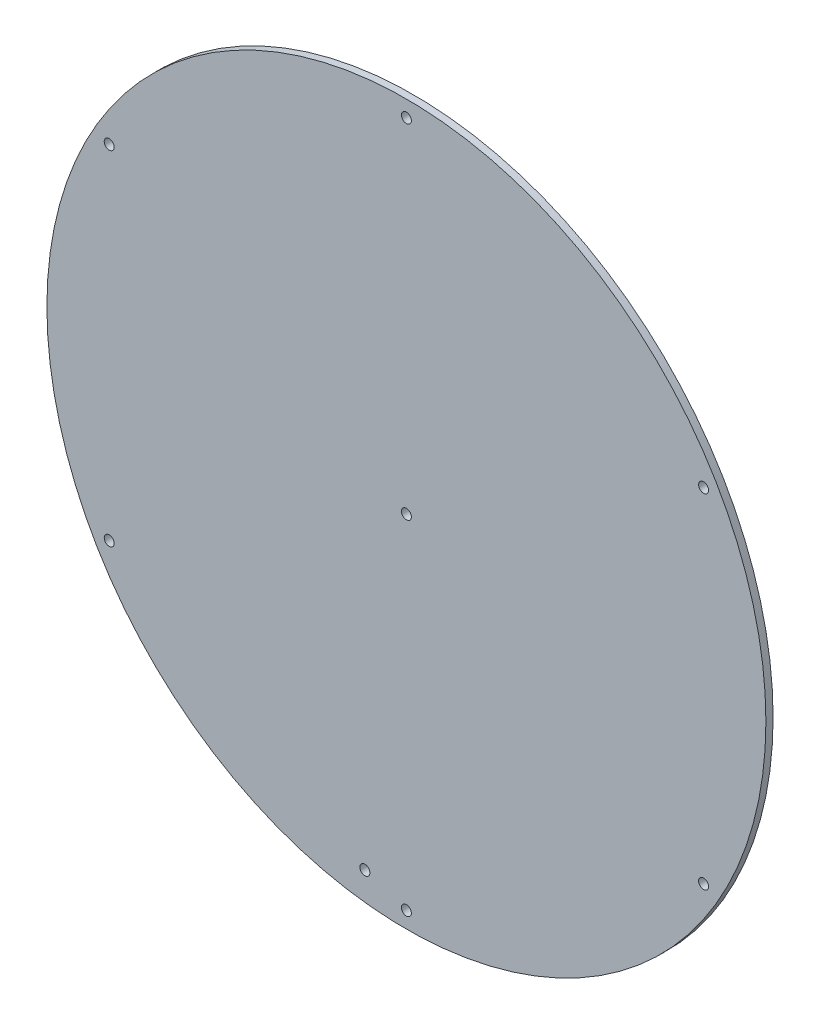
ISO-10303-21;
HEADER;
FILE_DESCRIPTION(('STEP AP214'),'2;1');
FILE_NAME('part.step','',(''),(''),'','','');
FILE_SCHEMA(('AUTOMOTIVE_DESIGN { 1 0 10303 214 1 1 1 1 }'));
ENDSEC;
DATA;
#1=APPLICATION_CONTEXT('core data for automotive mechanical design processes');
#2=APPLICATION_PROTOCOL_DEFINITION('international standard','automotive_design',2000,#1);
#3=PRODUCT_CONTEXT('',#1,'mechanical');
#4=PRODUCT('Part','Part','',(#3));
#5=PRODUCT_RELATED_PRODUCT_CATEGORY('part','',(#4));
#6=PRODUCT_DEFINITION_FORMATION('','',#4);
#7=PRODUCT_DEFINITION_CONTEXT('part definition',#1,'design');
#8=PRODUCT_DEFINITION('design','',#6,#7);
#9=PRODUCT_DEFINITION_SHAPE('','',#8);
#10=(LENGTH_UNIT() NAMED_UNIT(*) SI_UNIT(.MILLI.,.METRE.));
#11=(NAMED_UNIT(*) PLANE_ANGLE_UNIT() SI_UNIT($,.RADIAN.));
#12=(NAMED_UNIT(*) SI_UNIT($,.STERADIAN.) SOLID_ANGLE_UNIT());
#13=UNCERTAINTY_MEASURE_WITH_UNIT(LENGTH_MEASURE(1.E-05),#10,'distance_accuracy_value','');
#14=(GEOMETRIC_REPRESENTATION_CONTEXT(3) GLOBAL_UNCERTAINTY_ASSIGNED_CONTEXT((#13)) GLOBAL_UNIT_ASSIGNED_CONTEXT((#10,
#11,#12)) REPRESENTATION_CONTEXT('',''));
#15=CARTESIAN_POINT('',(0.,0.,0.));
#16=DIRECTION('',(0.,0.,1.));
#17=DIRECTION('',(1.,0.,0.));
#18=AXIS2_PLACEMENT_3D('',#15,#16,#17);
#19=CARTESIAN_POINT('',(0.,0.,2.2));
#20=DIRECTION('',(0.,0.,-1.));
#21=DIRECTION('',(-1.,0.,0.));
#22=AXIS2_PLACEMENT_3D('',#19,#20,#21);
#23=CYLINDRICAL_SURFACE('',#22,110.);
#24=CARTESIAN_POINT('',(0.,0.,2.2));
#25=DIRECTION('',(0.,0.,1.));
#26=DIRECTION('',(1.,0.,0.));
#27=AXIS2_PLACEMENT_3D('',#24,#25,#26);
#28=CIRCLE('',#27,110.);
#29=CARTESIAN_POINT('',(110.,0.,2.2));
#30=VERTEX_POINT('',#29);
#31=EDGE_CURVE('E11',#30,#30,#28,.T.);
#32=ORIENTED_EDGE('',*,*,#31,.F.);
#33=EDGE_LOOP('',(#32));
#34=FACE_BOUND('',#33,.T.);
#35=CARTESIAN_POINT('',(0.,0.,0.));
#36=DIRECTION('',(0.,0.,1.));
#37=DIRECTION('',(1.,0.,0.));
#38=AXIS2_PLACEMENT_3D('',#35,#36,#37);
#39=CIRCLE('',#38,110.);
#40=CARTESIAN_POINT('',(110.,0.,0.));
#41=VERTEX_POINT('',#40);
#42=EDGE_CURVE('E37',#41,#41,#39,.T.);
#43=ORIENTED_EDGE('',*,*,#42,.T.);
#44=EDGE_LOOP('',(#43));
#45=FACE_BOUND('',#44,.T.);
#46=ADVANCED_FACE('F34',(#34,#45),#23,.T.);
#47=CARTESIAN_POINT('',(0.,0.,2.2));
#48=DIRECTION('',(0.,0.,1.));
#49=DIRECTION('',(1.,0.,0.));
#50=AXIS2_PLACEMENT_3D('',#47,#48,#49);
#51=PLANE('',#50);
#52=CARTESIAN_POINT('',(-12.7,-100.6602,2.2));
#53=DIRECTION('',(0.,0.,-1.));
#54=DIRECTION('',(-1.,0.,0.));
#55=AXIS2_PLACEMENT_3D('',#52,#53,#54);
#56=CIRCLE('',#55,1.524);
#57=CARTESIAN_POINT('',(-14.224,-100.6602,2.2));
#58=VERTEX_POINT('',#57);
#59=EDGE_CURVE('E196',#58,#58,#56,.T.);
#60=ORIENTED_EDGE('',*,*,#59,.T.);
#61=EDGE_LOOP('',(#60));
#62=FACE_BOUND('',#61,.T.);
#63=CARTESIAN_POINT('',(0.,0.,2.2));
#64=DIRECTION('',(0.,0.,-1.));
#65=DIRECTION('',(-1.,0.,0.));
#66=AXIS2_PLACEMENT_3D('',#63,#64,#65);
#67=CIRCLE('',#66,1.52399999999999);
#68=CARTESIAN_POINT('',(-1.52399999999999,0.,2.2));
#69=VERTEX_POINT('',#68);
#70=EDGE_CURVE('E202',#69,#69,#67,.T.);
#71=ORIENTED_EDGE('',*,*,#70,.T.);
#72=EDGE_LOOP('',(#71));
#73=FACE_BOUND('',#72,.T.);
#74=CARTESIAN_POINT('',(90.9326673973654,52.5000000000011,2.2));
#75=DIRECTION('',(0.,0.,1.));
#76=DIRECTION('',(0.50000000000001,-0.866025403784433,0.));
#77=AXIS2_PLACEMENT_3D('',#74,#75,#76);
#78=CIRCLE('',#77,1.52399999999999);
#79=CARTESIAN_POINT('',(91.6946673973654,51.1801772846336,2.2));
#80=VERTEX_POINT('',#79);
#81=EDGE_CURVE('E320',#80,#80,#78,.T.);
#82=ORIENTED_EDGE('',*,*,#81,.F.);
#83=EDGE_LOOP('',(#82));
#84=FACE_BOUND('',#83,.T.);
#85=CARTESIAN_POINT('',(90.9326673973665,-52.4999999999992,2.2));
#86=DIRECTION('',(0.,0.,1.));
#87=DIRECTION('',(-0.499999999999992,-0.866025403784443,0.));
#88=AXIS2_PLACEMENT_3D('',#85,#86,#87);
#89=CIRCLE('',#88,1.52399999999999);
#90=CARTESIAN_POINT('',(90.1706673973666,-53.8198227153666,2.2));
#91=VERTEX_POINT('',#90);
#92=EDGE_CURVE('E330',#91,#91,#89,.T.);
#93=ORIENTED_EDGE('',*,*,#92,.F.);
#94=EDGE_LOOP('',(#93));
#95=FACE_BOUND('',#94,.T.);
#96=CARTESIAN_POINT('',(0.,-105.,2.2));
#97=DIRECTION('',(0.,0.,1.));
#98=DIRECTION('',(-1.,0.,0.));
#99=AXIS2_PLACEMENT_3D('',#96,#97,#98);
#100=CIRCLE('',#99,1.52399999999999);
#101=CARTESIAN_POINT('',(-1.52399999999999,-105.,2.2));
#102=VERTEX_POINT('',#101);
#103=EDGE_CURVE('E336',#102,#102,#100,.T.);
#104=ORIENTED_EDGE('',*,*,#103,.F.);
#105=EDGE_LOOP('',(#104));
#106=FACE_BOUND('',#105,.T.);
#107=CARTESIAN_POINT('',(-90.9326673973658,-52.5000000000004,2.2));
#108=DIRECTION('',(0.,0.,1.));
#109=DIRECTION('',(-0.500000000000004,0.866025403784436,0.));
#110=AXIS2_PLACEMENT_3D('',#107,#108,#109);
#111=CIRCLE('',#110,1.52399999999999);
#112=CARTESIAN_POINT('',(-91.6946673973658,-51.180177284633,2.2));
#113=VERTEX_POINT('',#112);
#114=EDGE_CURVE('E342',#113,#113,#111,.T.);
#115=ORIENTED_EDGE('',*,*,#114,.F.);
#116=EDGE_LOOP('',(#115));
#117=FACE_BOUND('',#116,.T.);
#118=CARTESIAN_POINT('',(-90.9326673973662,52.4999999999998,2.2));
#119=DIRECTION('',(0.,0.,1.));
#120=DIRECTION('',(0.499999999999998,0.86602540378444,0.));
#121=AXIS2_PLACEMENT_3D('',#118,#119,#120);
#122=CIRCLE('',#121,1.52399999999999);
#123=CARTESIAN_POINT('',(-90.1706673973662,53.8198227153673,2.2));
#124=VERTEX_POINT('',#123);
#125=EDGE_CURVE('E348',#124,#124,#122,.T.);
#126=ORIENTED_EDGE('',*,*,#125,.F.);
#127=EDGE_LOOP('',(#126));
#128=FACE_BOUND('',#127,.T.);
#129=CARTESIAN_POINT('',(0.,105.,2.2));
#130=DIRECTION('',(0.,0.,1.));
#131=DIRECTION('',(1.,0.,0.));
#132=AXIS2_PLACEMENT_3D('',#129,#130,#131);
#133=CIRCLE('',#132,1.52399999999999);
#134=CARTESIAN_POINT('',(1.52399999999999,105.,2.2));
#135=VERTEX_POINT('',#134);
#136=EDGE_CURVE('E354',#135,#135,#133,.T.);
#137=ORIENTED_EDGE('',*,*,#136,.F.);
#138=EDGE_LOOP('',(#137));
#139=FACE_BOUND('',#138,.T.);
#140=ORIENTED_EDGE('',*,*,#31,.T.);
#141=EDGE_LOOP('',(#140));
#142=FACE_BOUND('',#141,.T.);
#143=ADVANCED_FACE('F365',(#62,#73,#84,#95,#106,#117,#128,#139,#142),#51,.T.);
#144=CARTESIAN_POINT('',(0.,0.,0.));
#145=DIRECTION('',(0.,0.,1.));
#146=DIRECTION('',(1.,0.,0.));
#147=AXIS2_PLACEMENT_3D('',#144,#145,#146);
#148=PLANE('',#147);
#149=CARTESIAN_POINT('',(-11.3989155380916,-96.5924089289925,0.));
#150=DIRECTION('',(0.,0.,-1.));
#151=DIRECTION('',(0.,1.,0.));
#152=AXIS2_PLACEMENT_3D('',#149,#150,#151);
#153=ELLIPSE('',#152,1.44180623603057,0.830559885172298);
#154=CARTESIAN_POINT('',(-11.3989155380916,-95.150602692962,0.));
#155=VERTEX_POINT('',#154);
#156=EDGE_CURVE('E148',#155,#155,#153,.T.);
#157=ORIENTED_EDGE('',*,*,#156,.F.);
#158=EDGE_LOOP('',(#157));
#159=FACE_BOUND('',#158,.T.);
#160=DIRECTION('',(1.,0.,0.));
#161=VECTOR('',#160,1.);
#162=CARTESIAN_POINT('',(-13.0252272391858,-95.150602692962,0.));
#163=LINE('',#162,#161);
#164=CARTESIAN_POINT('',(-14.5843275318232,-95.150602692962,0.));
#165=VERTEX_POINT('',#164);
#166=CARTESIAN_POINT('',(-13.0252272391858,-95.150602692962,0.));
#167=VERTEX_POINT('',#166);
#168=EDGE_CURVE('E154',#165,#167,#163,.T.);
#169=ORIENTED_EDGE('',*,*,#168,.F.);
#170=DIRECTION('',(0.,1.,0.));
#171=VECTOR('',#170,1.);
#172=CARTESIAN_POINT('',(-14.5843275318232,-95.150602692962,0.));
#173=LINE('',#172,#171);
#174=CARTESIAN_POINT('',(-14.5843275318232,-98.0342151650231,0.));
#175=VERTEX_POINT('',#174);
#176=EDGE_CURVE('E48',#175,#165,#173,.T.);
#177=ORIENTED_EDGE('',*,*,#176,.F.);
#178=DIRECTION('',(-1.,0.,0.));
#179=VECTOR('',#178,1.);
#180=CARTESIAN_POINT('',(-13.0252272391858,-98.0342151650231,0.));
#181=LINE('',#180,#179);
#182=CARTESIAN_POINT('',(-13.0252272391858,-98.0342151650231,0.));
#183=VERTEX_POINT('',#182);
#184=EDGE_CURVE('E142',#183,#175,#181,.T.);
#185=ORIENTED_EDGE('',*,*,#184,.F.);
#186=DIRECTION('',(0.,-1.,0.));
#187=VECTOR('',#186,1.);
#188=CARTESIAN_POINT('',(-13.0252272391858,-95.150602692962,0.));
#189=LINE('',#188,#187);
#190=EDGE_CURVE('E145',#167,#183,#189,.T.);
#191=ORIENTED_EDGE('',*,*,#190,.F.);
#192=EDGE_LOOP('',(#169,#177,#185,#191));
#193=FACE_BOUND('',#192,.T.);
#194=CARTESIAN_POINT('',(-3.19999999999998,-90.805,0.));
#195=DIRECTION('',(0.,0.,-1.));
#196=DIRECTION('',(-1.,0.,0.));
#197=AXIS2_PLACEMENT_3D('',#194,#195,#196);
#198=ELLIPSE('',#197,1.75,0.899999999999998);
#199=CARTESIAN_POINT('',(-4.94999999999998,-90.805,0.));
#200=VERTEX_POINT('',#199);
#201=EDGE_CURVE('E161',#200,#200,#198,.T.);
#202=ORIENTED_EDGE('',*,*,#201,.F.);
#203=EDGE_LOOP('',(#202));
#204=FACE_BOUND('',#203,.T.);
#205=CARTESIAN_POINT('',(3.20000000000002,-90.805,0.));
#206=DIRECTION('',(0.,0.,-1.));
#207=DIRECTION('',(-1.,0.,0.));
#208=AXIS2_PLACEMENT_3D('',#205,#206,#207);
#209=ELLIPSE('',#208,1.75,0.899999999999998);
#210=CARTESIAN_POINT('',(1.45000000000002,-90.805,0.));
#211=VERTEX_POINT('',#210);
#212=EDGE_CURVE('E169',#211,#211,#209,.T.);
#213=ORIENTED_EDGE('',*,*,#212,.F.);
#214=EDGE_LOOP('',(#213));
#215=FACE_BOUND('',#214,.T.);
#216=CARTESIAN_POINT('',(-12.7,-100.6602,0.));
#217=DIRECTION('',(0.,0.,-1.));
#218=DIRECTION('',(-1.,0.,0.));
#219=AXIS2_PLACEMENT_3D('',#216,#217,#218);
#220=CIRCLE('',#219,1.524);
#221=CARTESIAN_POINT('',(-14.224,-100.6602,0.));
#222=VERTEX_POINT('',#221);
#223=EDGE_CURVE('E193',#222,#222,#220,.T.);
#224=ORIENTED_EDGE('',*,*,#223,.F.);
#225=EDGE_LOOP('',(#224));
#226=FACE_BOUND('',#225,.T.);
#227=CARTESIAN_POINT('',(0.,0.,0.));
#228=DIRECTION('',(0.,0.,-1.));
#229=DIRECTION('',(-1.,0.,0.));
#230=AXIS2_PLACEMENT_3D('',#227,#228,#229);
#231=CIRCLE('',#230,1.52399999999999);
#232=CARTESIAN_POINT('',(-1.52399999999999,0.,0.));
#233=VERTEX_POINT('',#232);
#234=EDGE_CURVE('E199',#233,#233,#231,.T.);
#235=ORIENTED_EDGE('',*,*,#234,.F.);
#236=EDGE_LOOP('',(#235));
#237=FACE_BOUND('',#236,.T.);
#238=CARTESIAN_POINT('',(-1.3998,-16.764,0.));
#239=DIRECTION('',(0.,0.,-1.));
#240=DIRECTION('',(0.,1.,0.));
#241=AXIS2_PLACEMENT_3D('',#238,#239,#240);
#242=ELLIPSE('',#241,1.80790939907896,1.);
#243=CARTESIAN_POINT('',(-1.3998,-14.956090600921,0.));
#244=VERTEX_POINT('',#243);
#245=EDGE_CURVE('E205',#244,#244,#242,.T.);
#246=ORIENTED_EDGE('',*,*,#245,.F.);
#247=EDGE_LOOP('',(#246));
#248=FACE_BOUND('',#247,.T.);
#249=CARTESIAN_POINT('',(-1.3998,-10.668,0.));
#250=DIRECTION('',(0.,0.,-1.));
#251=DIRECTION('',(0.,1.,0.));
#252=AXIS2_PLACEMENT_3D('',#249,#250,#251);
#253=ELLIPSE('',#252,1.80790939907896,1.);
#254=CARTESIAN_POINT('',(-1.3998,-8.86009060092104,0.));
#255=VERTEX_POINT('',#254);
#256=EDGE_CURVE('E212',#255,#255,#253,.T.);
#257=ORIENTED_EDGE('',*,*,#256,.F.);
#258=EDGE_LOOP('',(#257));
#259=FACE_BOUND('',#258,.T.);
#260=CARTESIAN_POINT('',(1.6002,-16.764,0.));
#261=DIRECTION('',(0.,0.,-1.));
#262=DIRECTION('',(0.,1.,0.));
#263=AXIS2_PLACEMENT_3D('',#260,#261,#262);
#264=ELLIPSE('',#263,1.80790939907896,1.);
#265=CARTESIAN_POINT('',(1.6002,-14.956090600921,0.));
#266=VERTEX_POINT('',#265);
#267=EDGE_CURVE('E235',#266,#266,#264,.T.);
#268=ORIENTED_EDGE('',*,*,#267,.F.);
#269=EDGE_LOOP('',(#268));
#270=FACE_BOUND('',#269,.T.);
#271=CARTESIAN_POINT('',(1.6002,-10.668,0.));
#272=DIRECTION('',(0.,0.,-1.));
#273=DIRECTION('',(0.,1.,0.));
#274=AXIS2_PLACEMENT_3D('',#271,#272,#273);
#275=ELLIPSE('',#274,1.80790939907896,1.);
#276=CARTESIAN_POINT('',(1.6002,-8.86009060092104,0.));
#277=VERTEX_POINT('',#276);
#278=EDGE_CURVE('E242',#277,#277,#275,.T.);
#279=ORIENTED_EDGE('',*,*,#278,.F.);
#280=EDGE_LOOP('',(#279));
#281=FACE_BOUND('',#280,.T.);
#282=DIRECTION('',(1.,0.,0.));
#283=VECTOR('',#282,1.);
#284=CARTESIAN_POINT('',(-1.088,63.936,0.));
#285=LINE('',#284,#283);
#286=CARTESIAN_POINT('',(-10.088,63.936,0.));
#287=VERTEX_POINT('',#286);
#288=CARTESIAN_POINT('',(-1.088,63.936,0.));
#289=VERTEX_POINT('',#288);
#290=EDGE_CURVE('E279',#287,#289,#285,.T.);
#291=ORIENTED_EDGE('',*,*,#290,.F.);
#292=DIRECTION('',(0.,1.,0.));
#293=VECTOR('',#292,1.);
#294=CARTESIAN_POINT('',(-10.088,63.936,0.));
#295=LINE('',#294,#293);
#296=CARTESIAN_POINT('',(-10.088,54.936,0.));
#297=VERTEX_POINT('',#296);
#298=EDGE_CURVE('E56',#297,#287,#295,.T.);
#299=ORIENTED_EDGE('',*,*,#298,.F.);
#300=DIRECTION('',(-1.,0.,0.));
#301=VECTOR('',#300,1.);
#302=CARTESIAN_POINT('',(-1.08800000000001,54.936,0.));
#303=LINE('',#302,#301);
#304=CARTESIAN_POINT('',(-1.08800000000001,54.936,0.));
#305=VERTEX_POINT('',#304);
#306=EDGE_CURVE('E268',#305,#297,#303,.T.);
#307=ORIENTED_EDGE('',*,*,#306,.F.);
#308=DIRECTION('',(0.,-1.,0.));
#309=VECTOR('',#308,1.);
#310=CARTESIAN_POINT('',(-1.088,63.936,0.));
#311=LINE('',#310,#309);
#312=EDGE_CURVE('E282',#289,#305,#311,.T.);
#313=ORIENTED_EDGE('',*,*,#312,.F.);
#314=EDGE_LOOP('',(#291,#299,#307,#313));
#315=FACE_BOUND('',#314,.T.);
#316=DIRECTION('',(1.,0.,0.));
#317=VECTOR('',#316,1.);
#318=CARTESIAN_POINT('',(15.17,63.936,0.));
#319=LINE('',#318,#317);
#320=CARTESIAN_POINT('',(6.16999999999999,63.936,0.));
#321=VERTEX_POINT('',#320);
#322=CARTESIAN_POINT('',(15.17,63.936,0.));
#323=VERTEX_POINT('',#322);
#324=EDGE_CURVE('E310',#321,#323,#319,.T.);
#325=ORIENTED_EDGE('',*,*,#324,.F.);
#326=DIRECTION('',(0.,1.,0.));
#327=VECTOR('',#326,1.);
#328=CARTESIAN_POINT('',(6.16999999999999,54.936,0.));
#329=LINE('',#328,#327);
#330=CARTESIAN_POINT('',(6.16999999999999,54.936,0.));
#331=VERTEX_POINT('',#330);
#332=EDGE_CURVE('E289',#331,#321,#329,.T.);
#333=ORIENTED_EDGE('',*,*,#332,.F.);
#334=DIRECTION('',(-1.,0.,0.));
#335=VECTOR('',#334,1.);
#336=CARTESIAN_POINT('',(15.17,54.936,0.));
#337=LINE('',#336,#335);
#338=CARTESIAN_POINT('',(15.17,54.936,0.));
#339=VERTEX_POINT('',#338);
#340=EDGE_CURVE('E299',#339,#331,#337,.T.);
#341=ORIENTED_EDGE('',*,*,#340,.F.);
#342=DIRECTION('',(0.,-1.,0.));
#343=VECTOR('',#342,1.);
#344=CARTESIAN_POINT('',(15.17,54.936,0.));
#345=LINE('',#344,#343);
#346=EDGE_CURVE('E313',#323,#339,#345,.T.);
#347=ORIENTED_EDGE('',*,*,#346,.F.);
#348=EDGE_LOOP('',(#325,#333,#341,#347));
#349=FACE_BOUND('',#348,.T.);
#350=CARTESIAN_POINT('',(90.9326673973654,52.5000000000011,0.));
#351=DIRECTION('',(0.,0.,1.));
#352=DIRECTION('',(0.50000000000001,-0.866025403784433,0.));
#353=AXIS2_PLACEMENT_3D('',#350,#351,#352);
#354=CIRCLE('',#353,1.52399999999999);
#355=CARTESIAN_POINT('',(91.6946673973654,51.1801772846336,0.));
#356=VERTEX_POINT('',#355);
#357=EDGE_CURVE('E327',#356,#356,#354,.T.);
#358=ORIENTED_EDGE('',*,*,#357,.T.);
#359=EDGE_LOOP('',(#358));
#360=FACE_BOUND('',#359,.T.);
#361=CARTESIAN_POINT('',(90.9326673973665,-52.4999999999992,0.));
#362=DIRECTION('',(0.,0.,1.));
#363=DIRECTION('',(-0.499999999999992,-0.866025403784443,0.));
#364=AXIS2_PLACEMENT_3D('',#361,#362,#363);
#365=CIRCLE('',#364,1.52399999999999);
#366=CARTESIAN_POINT('',(90.1706673973666,-53.8198227153666,0.));
#367=VERTEX_POINT('',#366);
#368=EDGE_CURVE('E333',#367,#367,#365,.T.);
#369=ORIENTED_EDGE('',*,*,#368,.T.);
#370=EDGE_LOOP('',(#369));
#371=FACE_BOUND('',#370,.T.);
#372=CARTESIAN_POINT('',(0.,-105.,0.));
#373=DIRECTION('',(0.,0.,1.));
#374=DIRECTION('',(-1.,0.,0.));
#375=AXIS2_PLACEMENT_3D('',#372,#373,#374);
#376=CIRCLE('',#375,1.52399999999999);
#377=CARTESIAN_POINT('',(-1.52399999999999,-105.,0.));
#378=VERTEX_POINT('',#377);
#379=EDGE_CURVE('E339',#378,#378,#376,.T.);
#380=ORIENTED_EDGE('',*,*,#379,.T.);
#381=EDGE_LOOP('',(#380));
#382=FACE_BOUND('',#381,.T.);
#383=CARTESIAN_POINT('',(-90.9326673973658,-52.5000000000004,0.));
#384=DIRECTION('',(0.,0.,1.));
#385=DIRECTION('',(-0.500000000000004,0.866025403784436,0.));
#386=AXIS2_PLACEMENT_3D('',#383,#384,#385);
#387=CIRCLE('',#386,1.52399999999999);
#388=CARTESIAN_POINT('',(-91.6946673973658,-51.180177284633,0.));
#389=VERTEX_POINT('',#388);
#390=EDGE_CURVE('E345',#389,#389,#387,.T.);
#391=ORIENTED_EDGE('',*,*,#390,.T.);
#392=EDGE_LOOP('',(#391));
#393=FACE_BOUND('',#392,.T.);
#394=CARTESIAN_POINT('',(-90.9326673973662,52.4999999999998,0.));
#395=DIRECTION('',(0.,0.,1.));
#396=DIRECTION('',(0.499999999999998,0.86602540378444,0.));
#397=AXIS2_PLACEMENT_3D('',#394,#395,#396);
#398=CIRCLE('',#397,1.52399999999999);
#399=CARTESIAN_POINT('',(-90.1706673973662,53.8198227153673,0.));
#400=VERTEX_POINT('',#399);
#401=EDGE_CURVE('E351',#400,#400,#398,.T.);
#402=ORIENTED_EDGE('',*,*,#401,.T.);
#403=EDGE_LOOP('',(#402));
#404=FACE_BOUND('',#403,.T.);
#405=CARTESIAN_POINT('',(0.,105.,0.));
#406=DIRECTION('',(0.,0.,1.));
#407=DIRECTION('',(1.,0.,0.));
#408=AXIS2_PLACEMENT_3D('',#405,#406,#407);
#409=CIRCLE('',#408,1.52399999999999);
#410=CARTESIAN_POINT('',(1.52399999999999,105.,0.));
#411=VERTEX_POINT('',#410);
#412=EDGE_CURVE('E357',#411,#411,#409,.T.);
#413=ORIENTED_EDGE('',*,*,#412,.T.);
#414=EDGE_LOOP('',(#413));
#415=FACE_BOUND('',#414,.T.);
#416=ORIENTED_EDGE('',*,*,#42,.F.);
#417=EDGE_LOOP('',(#416));
#418=FACE_BOUND('',#417,.T.);
#419=ADVANCED_FACE('F368',(#159,#193,#204,#215,#226,#237,#248,#259,#270,#281,#315,#349,#360,
#371,#382,#393,#404,#415,#418),#148,.F.);
#420=CARTESIAN_POINT('',(0.,105.,0.));
#421=DIRECTION('',(0.,0.,1.));
#422=DIRECTION('',(1.,0.,0.));
#423=AXIS2_PLACEMENT_3D('',#420,#421,#422);
#424=CYLINDRICAL_SURFACE('',#423,1.52399999999999);
#425=ORIENTED_EDGE('',*,*,#412,.F.);
#426=EDGE_LOOP('',(#425));
#427=FACE_BOUND('',#426,.T.);
#428=ORIENTED_EDGE('',*,*,#136,.T.);
#429=EDGE_LOOP('',(#428));
#430=FACE_BOUND('',#429,.T.);
#431=ADVANCED_FACE('F363',(#427,#430),#424,.F.);
#432=CARTESIAN_POINT('',(-90.9326673973662,52.4999999999998,0.));
#433=DIRECTION('',(0.,0.,1.));
#434=DIRECTION('',(1.,0.,0.));
#435=AXIS2_PLACEMENT_3D('',#432,#433,#434);
#436=CYLINDRICAL_SURFACE('',#435,1.52399999999999);
#437=ORIENTED_EDGE('',*,*,#401,.F.);
#438=EDGE_LOOP('',(#437));
#439=FACE_BOUND('',#438,.T.);
#440=ORIENTED_EDGE('',*,*,#125,.T.);
#441=EDGE_LOOP('',(#440));
#442=FACE_BOUND('',#441,.T.);
#443=ADVANCED_FACE('F383',(#439,#442),#436,.F.);
#444=CARTESIAN_POINT('',(-90.9326673973658,-52.5000000000004,0.));
#445=DIRECTION('',(0.,0.,1.));
#446=DIRECTION('',(1.,0.,0.));
#447=AXIS2_PLACEMENT_3D('',#444,#445,#446);
#448=CYLINDRICAL_SURFACE('',#447,1.52399999999999);
#449=ORIENTED_EDGE('',*,*,#390,.F.);
#450=EDGE_LOOP('',(#449));
#451=FACE_BOUND('',#450,.T.);
#452=ORIENTED_EDGE('',*,*,#114,.T.);
#453=EDGE_LOOP('',(#452));
#454=FACE_BOUND('',#453,.T.);
#455=ADVANCED_FACE('F391',(#451,#454),#448,.F.);
#456=CARTESIAN_POINT('',(0.,-105.,0.));
#457=DIRECTION('',(0.,0.,1.));
#458=DIRECTION('',(1.,0.,0.));
#459=AXIS2_PLACEMENT_3D('',#456,#457,#458);
#460=CYLINDRICAL_SURFACE('',#459,1.52399999999999);
#461=ORIENTED_EDGE('',*,*,#379,.F.);
#462=EDGE_LOOP('',(#461));
#463=FACE_BOUND('',#462,.T.);
#464=ORIENTED_EDGE('',*,*,#103,.T.);
#465=EDGE_LOOP('',(#464));
#466=FACE_BOUND('',#465,.T.);
#467=ADVANCED_FACE('F395',(#463,#466),#460,.F.);
#468=CARTESIAN_POINT('',(90.9326673973665,-52.4999999999992,0.));
#469=DIRECTION('',(0.,0.,1.));
#470=DIRECTION('',(1.,0.,0.));
#471=AXIS2_PLACEMENT_3D('',#468,#469,#470);
#472=CYLINDRICAL_SURFACE('',#471,1.52399999999999);
#473=ORIENTED_EDGE('',*,*,#368,.F.);
#474=EDGE_LOOP('',(#473));
#475=FACE_BOUND('',#474,.T.);
#476=ORIENTED_EDGE('',*,*,#92,.T.);
#477=EDGE_LOOP('',(#476));
#478=FACE_BOUND('',#477,.T.);
#479=ADVANCED_FACE('F399',(#475,#478),#472,.F.);
#480=CARTESIAN_POINT('',(90.9326673973654,52.5000000000011,0.));
#481=DIRECTION('',(0.,0.,1.));
#482=DIRECTION('',(1.,0.,0.));
#483=AXIS2_PLACEMENT_3D('',#480,#481,#482);
#484=CYLINDRICAL_SURFACE('',#483,1.52399999999999);
#485=ORIENTED_EDGE('',*,*,#357,.F.);
#486=EDGE_LOOP('',(#485));
#487=FACE_BOUND('',#486,.T.);
#488=ORIENTED_EDGE('',*,*,#81,.T.);
#489=EDGE_LOOP('',(#488));
#490=FACE_BOUND('',#489,.T.);
#491=ADVANCED_FACE('F403',(#487,#490),#484,.F.);
#492=CARTESIAN_POINT('',(6.16999999999999,54.936,0.5));
#493=DIRECTION('',(-1.,0.,0.));
#494=DIRECTION('',(0.,0.,1.));
#495=AXIS2_PLACEMENT_3D('',#492,#493,#494);
#496=PLANE('',#495);
#497=ORIENTED_EDGE('',*,*,#332,.T.);
#498=DIRECTION('',(0.,0.,-1.));
#499=VECTOR('',#498,1.);
#500=CARTESIAN_POINT('',(6.16999999999999,63.936,0.5));
#501=LINE('',#500,#499);
#502=CARTESIAN_POINT('',(6.16999999999999,63.936,0.5));
#503=VERTEX_POINT('',#502);
#504=EDGE_CURVE('E308',#503,#321,#501,.T.);
#505=ORIENTED_EDGE('',*,*,#504,.F.);
#506=DIRECTION('',(0.,1.,0.));
#507=VECTOR('',#506,1.);
#508=CARTESIAN_POINT('',(6.16999999999999,54.936,0.5));
#509=LINE('',#508,#507);
#510=CARTESIAN_POINT('',(6.16999999999999,54.936,0.5));
#511=VERTEX_POINT('',#510);
#512=EDGE_CURVE('E295',#511,#503,#509,.T.);
#513=ORIENTED_EDGE('',*,*,#512,.F.);
#514=DIRECTION('',(0.,0.,-1.));
#515=VECTOR('',#514,1.);
#516=CARTESIAN_POINT('',(6.16999999999999,54.936,0.5));
#517=LINE('',#516,#515);
#518=EDGE_CURVE('E318',#511,#331,#517,.T.);
#519=ORIENTED_EDGE('',*,*,#518,.T.);
#520=EDGE_LOOP('',(#497,#505,#513,#519));
#521=FACE_BOUND('',#520,.T.);
#522=ADVANCED_FACE('F407',(#521),#496,.F.);
#523=CARTESIAN_POINT('',(15.17,54.936,0.5));
#524=DIRECTION('',(0.,-1.,0.));
#525=DIRECTION('',(0.,0.,-1.));
#526=AXIS2_PLACEMENT_3D('',#523,#524,#525);
#527=PLANE('',#526);
#528=ORIENTED_EDGE('',*,*,#340,.T.);
#529=ORIENTED_EDGE('',*,*,#518,.F.);
#530=DIRECTION('',(-1.,0.,0.));
#531=VECTOR('',#530,1.);
#532=CARTESIAN_POINT('',(15.17,54.936,0.5));
#533=LINE('',#532,#531);
#534=CARTESIAN_POINT('',(15.17,54.936,0.5));
#535=VERTEX_POINT('',#534);
#536=EDGE_CURVE('E305',#535,#511,#533,.T.);
#537=ORIENTED_EDGE('',*,*,#536,.F.);
#538=DIRECTION('',(0.,0.,-1.));
#539=VECTOR('',#538,1.);
#540=CARTESIAN_POINT('',(15.17,54.936,0.5));
#541=LINE('',#540,#539);
#542=EDGE_CURVE('E321',#535,#339,#541,.T.);
#543=ORIENTED_EDGE('',*,*,#542,.T.);
#544=EDGE_LOOP('',(#528,#529,#537,#543));
#545=FACE_BOUND('',#544,.T.);
#546=ADVANCED_FACE('F411',(#545),#527,.F.);
#547=CARTESIAN_POINT('',(15.17,54.936,0.5));
#548=DIRECTION('',(1.,0.,0.));
#549=DIRECTION('',(0.,0.,-1.));
#550=AXIS2_PLACEMENT_3D('',#547,#548,#549);
#551=PLANE('',#550);
#552=ORIENTED_EDGE('',*,*,#346,.T.);
#553=ORIENTED_EDGE('',*,*,#542,.F.);
#554=DIRECTION('',(0.,-1.,0.));
#555=VECTOR('',#554,1.);
#556=CARTESIAN_POINT('',(15.17,54.936,0.5));
#557=LINE('',#556,#555);
#558=CARTESIAN_POINT('',(15.17,63.936,0.5));
#559=VERTEX_POINT('',#558);
#560=EDGE_CURVE('E302',#559,#535,#557,.T.);
#561=ORIENTED_EDGE('',*,*,#560,.F.);
#562=DIRECTION('',(0.,0.,-1.));
#563=VECTOR('',#562,1.);
#564=CARTESIAN_POINT('',(15.17,63.936,0.5));
#565=LINE('',#564,#563);
#566=EDGE_CURVE('E323',#559,#323,#565,.T.);
#567=ORIENTED_EDGE('',*,*,#566,.T.);
#568=EDGE_LOOP('',(#552,#553,#561,#567));
#569=FACE_BOUND('',#568,.T.);
#570=ADVANCED_FACE('F417',(#569),#551,.F.);
#571=CARTESIAN_POINT('',(15.17,63.936,0.5));
#572=DIRECTION('',(0.,1.,0.));
#573=DIRECTION('',(0.,0.,1.));
#574=AXIS2_PLACEMENT_3D('',#571,#572,#573);
#575=PLANE('',#574);
#576=ORIENTED_EDGE('',*,*,#324,.T.);
#577=ORIENTED_EDGE('',*,*,#566,.F.);
#578=DIRECTION('',(1.,0.,0.));
#579=VECTOR('',#578,1.);
#580=CARTESIAN_POINT('',(15.17,63.936,0.5));
#581=LINE('',#580,#579);
#582=EDGE_CURVE('E298',#503,#559,#581,.T.);
#583=ORIENTED_EDGE('',*,*,#582,.F.);
#584=ORIENTED_EDGE('',*,*,#504,.T.);
#585=EDGE_LOOP('',(#576,#577,#583,#584));
#586=FACE_BOUND('',#585,.T.);
#587=ADVANCED_FACE('F413',(#586),#575,.F.);
#588=CARTESIAN_POINT('',(0.,0.,0.5));
#589=DIRECTION('',(0.,0.,1.));
#590=DIRECTION('',(1.,0.,0.));
#591=AXIS2_PLACEMENT_3D('',#588,#589,#590);
#592=PLANE('',#591);
#593=ORIENTED_EDGE('',*,*,#512,.T.);
#594=ORIENTED_EDGE('',*,*,#582,.T.);
#595=ORIENTED_EDGE('',*,*,#560,.T.);
#596=ORIENTED_EDGE('',*,*,#536,.T.);
#597=EDGE_LOOP('',(#593,#594,#595,#596));
#598=FACE_BOUND('',#597,.T.);
#599=ADVANCED_FACE('F416',(#598),#592,.F.);
#600=CARTESIAN_POINT('',(-10.088,63.936,0.5));
#601=DIRECTION('',(-1.,0.,0.));
#602=DIRECTION('',(0.,-1.,0.));
#603=AXIS2_PLACEMENT_3D('',#600,#601,#602);
#604=PLANE('',#603);
#605=ORIENTED_EDGE('',*,*,#298,.T.);
#606=DIRECTION('',(0.,0.,-1.));
#607=VECTOR('',#606,1.);
#608=CARTESIAN_POINT('',(-10.088,63.936,0.5));
#609=LINE('',#608,#607);
#610=CARTESIAN_POINT('',(-10.088,63.936,0.5));
#611=VERTEX_POINT('',#610);
#612=EDGE_CURVE('E277',#611,#287,#609,.T.);
#613=ORIENTED_EDGE('',*,*,#612,.F.);
#614=DIRECTION('',(0.,1.,0.));
#615=VECTOR('',#614,1.);
#616=CARTESIAN_POINT('',(-10.088,63.936,0.5));
#617=LINE('',#616,#615);
#618=CARTESIAN_POINT('',(-10.088,54.936,0.5));
#619=VERTEX_POINT('',#618);
#620=EDGE_CURVE('E264',#619,#611,#617,.T.);
#621=ORIENTED_EDGE('',*,*,#620,.F.);
#622=DIRECTION('',(0.,0.,-1.));
#623=VECTOR('',#622,1.);
#624=CARTESIAN_POINT('',(-10.088,54.936,0.5));
#625=LINE('',#624,#623);
#626=EDGE_CURVE('E287',#619,#297,#625,.T.);
#627=ORIENTED_EDGE('',*,*,#626,.T.);
#628=EDGE_LOOP('',(#605,#613,#621,#627));
#629=FACE_BOUND('',#628,.T.);
#630=ADVANCED_FACE('F427',(#629),#604,.F.);
#631=CARTESIAN_POINT('',(-1.08800000000001,54.936,0.5));
#632=DIRECTION('',(0.,-1.,0.));
#633=DIRECTION('',(0.,0.,-1.));
#634=AXIS2_PLACEMENT_3D('',#631,#632,#633);
#635=PLANE('',#634);
#636=ORIENTED_EDGE('',*,*,#306,.T.);
#637=ORIENTED_EDGE('',*,*,#626,.F.);
#638=DIRECTION('',(-1.,0.,0.));
#639=VECTOR('',#638,1.);
#640=CARTESIAN_POINT('',(-1.08800000000001,54.936,0.5));
#641=LINE('',#640,#639);
#642=CARTESIAN_POINT('',(-1.08800000000001,54.936,0.5));
#643=VERTEX_POINT('',#642);
#644=EDGE_CURVE('E274',#643,#619,#641,.T.);
#645=ORIENTED_EDGE('',*,*,#644,.F.);
#646=DIRECTION('',(0.,0.,-1.));
#647=VECTOR('',#646,1.);
#648=CARTESIAN_POINT('',(-1.08800000000001,54.936,0.5));
#649=LINE('',#648,#647);
#650=EDGE_CURVE('E290',#643,#305,#649,.T.);
#651=ORIENTED_EDGE('',*,*,#650,.T.);
#652=EDGE_LOOP('',(#636,#637,#645,#651));
#653=FACE_BOUND('',#652,.T.);
#654=ADVANCED_FACE('F431',(#653),#635,.F.);
#655=CARTESIAN_POINT('',(-1.088,63.936,0.5));
#656=DIRECTION('',(1.,0.,0.));
#657=DIRECTION('',(0.,1.,0.));
#658=AXIS2_PLACEMENT_3D('',#655,#656,#657);
#659=PLANE('',#658);
#660=ORIENTED_EDGE('',*,*,#312,.T.);
#661=ORIENTED_EDGE('',*,*,#650,.F.);
#662=DIRECTION('',(0.,-1.,0.));
#663=VECTOR('',#662,1.);
#664=CARTESIAN_POINT('',(-1.088,63.936,0.5));
#665=LINE('',#664,#663);
#666=CARTESIAN_POINT('',(-1.088,63.936,0.5));
#667=VERTEX_POINT('',#666);
#668=EDGE_CURVE('E271',#667,#643,#665,.T.);
#669=ORIENTED_EDGE('',*,*,#668,.F.);
#670=DIRECTION('',(0.,0.,-1.));
#671=VECTOR('',#670,1.);
#672=CARTESIAN_POINT('',(-1.088,63.936,0.5));
#673=LINE('',#672,#671);
#674=EDGE_CURVE('E292',#667,#289,#673,.T.);
#675=ORIENTED_EDGE('',*,*,#674,.T.);
#676=EDGE_LOOP('',(#660,#661,#669,#675));
#677=FACE_BOUND('',#676,.T.);
#678=ADVANCED_FACE('F435',(#677),#659,.F.);
#679=CARTESIAN_POINT('',(-1.088,63.936,0.5));
#680=DIRECTION('',(0.,1.,0.));
#681=DIRECTION('',(0.,0.,1.));
#682=AXIS2_PLACEMENT_3D('',#679,#680,#681);
#683=PLANE('',#682);
#684=ORIENTED_EDGE('',*,*,#290,.T.);
#685=ORIENTED_EDGE('',*,*,#674,.F.);
#686=DIRECTION('',(1.,0.,0.));
#687=VECTOR('',#686,1.);
#688=CARTESIAN_POINT('',(-1.088,63.936,0.5));
#689=LINE('',#688,#687);
#690=EDGE_CURVE('E267',#611,#667,#689,.T.);
#691=ORIENTED_EDGE('',*,*,#690,.F.);
#692=ORIENTED_EDGE('',*,*,#612,.T.);
#693=EDGE_LOOP('',(#684,#685,#691,#692));
#694=FACE_BOUND('',#693,.T.);
#695=ADVANCED_FACE('F432',(#694),#683,.F.);
#696=CARTESIAN_POINT('',(0.,0.,0.5));
#697=DIRECTION('',(0.,0.,-1.));
#698=DIRECTION('',(-1.,0.,0.));
#699=AXIS2_PLACEMENT_3D('',#696,#697,#698);
#700=PLANE('',#699);
#701=ORIENTED_EDGE('',*,*,#620,.T.);
#702=ORIENTED_EDGE('',*,*,#690,.T.);
#703=ORIENTED_EDGE('',*,*,#668,.T.);
#704=ORIENTED_EDGE('',*,*,#644,.T.);
#705=EDGE_LOOP('',(#701,#702,#703,#704));
#706=FACE_BOUND('',#705,.T.);
#707=ADVANCED_FACE('F255',(#706),#700,.T.);
#708=CARTESIAN_POINT('',(1.6002,-10.668,0.2));
#709=DIRECTION('',(0.,0.,-1.));
#710=DIRECTION('',(0.,1.,0.));
#711=AXIS2_PLACEMENT_3D('',#708,#709,#710);
#712=ELLIPSE('',#711,1.80790939907896,1.);
#713=DIRECTION('',(0.,0.,-1.));
#714=VECTOR('',#713,1.);
#715=SURFACE_OF_LINEAR_EXTRUSION('',#712,#714);
#716=CARTESIAN_POINT('',(1.6002,-8.86009060092104,0.2));
#717=VERTEX_POINT('',#716);
#718=EDGE_CURVE('E258',#717,#717,#712,.T.);
#719=ORIENTED_EDGE('',*,*,#718,.F.);
#720=EDGE_LOOP('',(#719));
#721=FACE_BOUND('',#720,.T.);
#722=ORIENTED_EDGE('',*,*,#278,.T.);
#723=EDGE_LOOP('',(#722));
#724=FACE_BOUND('',#723,.T.);
#725=ADVANCED_FACE('F251',(#721,#724),#715,.F.);
#726=CARTESIAN_POINT('',(1.6002,-10.668,0.2));
#727=DIRECTION('',(0.,0.,-1.));
#728=DIRECTION('',(-1.,0.,0.));
#729=AXIS2_PLACEMENT_3D('',#726,#727,#728);
#730=PLANE('',#729);
#731=ORIENTED_EDGE('',*,*,#718,.T.);
#732=EDGE_LOOP('',(#731));
#733=FACE_BOUND('',#732,.T.);
#734=ADVANCED_FACE('F247',(#733),#730,.T.);
#735=CARTESIAN_POINT('',(1.6002,-16.764,0.2));
#736=DIRECTION('',(0.,0.,-1.));
#737=DIRECTION('',(0.,1.,0.));
#738=AXIS2_PLACEMENT_3D('',#735,#736,#737);
#739=ELLIPSE('',#738,1.80790939907896,1.);
#740=DIRECTION('',(0.,0.,-1.));
#741=VECTOR('',#740,1.);
#742=SURFACE_OF_LINEAR_EXTRUSION('',#739,#741);
#743=CARTESIAN_POINT('',(1.6002,-14.956090600921,0.2));
#744=VERTEX_POINT('',#743);
#745=EDGE_CURVE('E238',#744,#744,#739,.T.);
#746=ORIENTED_EDGE('',*,*,#745,.F.);
#747=EDGE_LOOP('',(#746));
#748=FACE_BOUND('',#747,.T.);
#749=ORIENTED_EDGE('',*,*,#267,.T.);
#750=EDGE_LOOP('',(#749));
#751=FACE_BOUND('',#750,.T.);
#752=ADVANCED_FACE('F244',(#748,#751),#742,.F.);
#753=CARTESIAN_POINT('',(1.6002,-16.764,0.2));
#754=DIRECTION('',(0.,0.,-1.));
#755=DIRECTION('',(-1.,0.,0.));
#756=AXIS2_PLACEMENT_3D('',#753,#754,#755);
#757=PLANE('',#756);
#758=ORIENTED_EDGE('',*,*,#745,.T.);
#759=EDGE_LOOP('',(#758));
#760=FACE_BOUND('',#759,.T.);
#761=ADVANCED_FACE('F228',(#760),#757,.T.);
#762=CARTESIAN_POINT('',(-1.3998,-10.668,0.2));
#763=DIRECTION('',(0.,0.,-1.));
#764=DIRECTION('',(0.,1.,0.));
#765=AXIS2_PLACEMENT_3D('',#762,#763,#764);
#766=ELLIPSE('',#765,1.80790939907896,1.);
#767=DIRECTION('',(0.,0.,-1.));
#768=VECTOR('',#767,1.);
#769=SURFACE_OF_LINEAR_EXTRUSION('',#766,#768);
#770=CARTESIAN_POINT('',(-1.3998,-8.86009060092104,0.2));
#771=VERTEX_POINT('',#770);
#772=EDGE_CURVE('E231',#771,#771,#766,.T.);
#773=ORIENTED_EDGE('',*,*,#772,.F.);
#774=EDGE_LOOP('',(#773));
#775=FACE_BOUND('',#774,.T.);
#776=ORIENTED_EDGE('',*,*,#256,.T.);
#777=EDGE_LOOP('',(#776));
#778=FACE_BOUND('',#777,.T.);
#779=ADVANCED_FACE('F224',(#775,#778),#769,.F.);
#780=CARTESIAN_POINT('',(-1.3998,-10.668,0.2));
#781=DIRECTION('',(0.,0.,-1.));
#782=DIRECTION('',(-1.,0.,0.));
#783=AXIS2_PLACEMENT_3D('',#780,#781,#782);
#784=PLANE('',#783);
#785=ORIENTED_EDGE('',*,*,#772,.T.);
#786=EDGE_LOOP('',(#785));
#787=FACE_BOUND('',#786,.T.);
#788=ADVANCED_FACE('F220',(#787),#784,.T.);
#789=CARTESIAN_POINT('',(-1.3998,-16.764,0.2));
#790=DIRECTION('',(0.,0.,-1.));
#791=DIRECTION('',(0.,1.,0.));
#792=AXIS2_PLACEMENT_3D('',#789,#790,#791);
#793=ELLIPSE('',#792,1.80790939907896,1.);
#794=DIRECTION('',(0.,0.,-1.));
#795=VECTOR('',#794,1.);
#796=SURFACE_OF_LINEAR_EXTRUSION('',#793,#795);
#797=CARTESIAN_POINT('',(-1.3998,-14.956090600921,0.2));
#798=VERTEX_POINT('',#797);
#799=EDGE_CURVE('E208',#798,#798,#793,.T.);
#800=ORIENTED_EDGE('',*,*,#799,.F.);
#801=EDGE_LOOP('',(#800));
#802=FACE_BOUND('',#801,.T.);
#803=ORIENTED_EDGE('',*,*,#245,.T.);
#804=EDGE_LOOP('',(#803));
#805=FACE_BOUND('',#804,.T.);
#806=ADVANCED_FACE('F215',(#802,#805),#796,.F.);
#807=CARTESIAN_POINT('',(-1.3998,-16.764,0.2));
#808=DIRECTION('',(0.,0.,-1.));
#809=DIRECTION('',(-1.,0.,0.));
#810=AXIS2_PLACEMENT_3D('',#807,#808,#809);
#811=PLANE('',#810);
#812=ORIENTED_EDGE('',*,*,#799,.T.);
#813=EDGE_LOOP('',(#812));
#814=FACE_BOUND('',#813,.T.);
#815=ADVANCED_FACE('F219',(#814),#811,.T.);
#816=CARTESIAN_POINT('',(0.,0.,2.2));
#817=DIRECTION('',(0.,0.,-1.));
#818=DIRECTION('',(-1.,0.,0.));
#819=AXIS2_PLACEMENT_3D('',#816,#817,#818);
#820=CYLINDRICAL_SURFACE('',#819,1.52399999999999);
#821=ORIENTED_EDGE('',*,*,#70,.F.);
#822=EDGE_LOOP('',(#821));
#823=FACE_BOUND('',#822,.T.);
#824=ORIENTED_EDGE('',*,*,#234,.T.);
#825=EDGE_LOOP('',(#824));
#826=FACE_BOUND('',#825,.T.);
#827=ADVANCED_FACE('F494',(#823,#826),#820,.F.);
#828=CARTESIAN_POINT('',(-12.7,-100.6602,2.2));
#829=DIRECTION('',(0.,0.,-1.));
#830=DIRECTION('',(-1.,0.,0.));
#831=AXIS2_PLACEMENT_3D('',#828,#829,#830);
#832=CYLINDRICAL_SURFACE('',#831,1.524);
#833=ORIENTED_EDGE('',*,*,#59,.F.);
#834=EDGE_LOOP('',(#833));
#835=FACE_BOUND('',#834,.T.);
#836=ORIENTED_EDGE('',*,*,#223,.T.);
#837=EDGE_LOOP('',(#836));
#838=FACE_BOUND('',#837,.T.);
#839=ADVANCED_FACE('F186',(#835,#838),#832,.F.);
#840=CARTESIAN_POINT('',(3.20000000000002,-90.805,0.2));
#841=DIRECTION('',(0.,0.,-1.));
#842=DIRECTION('',(-1.,0.,0.));
#843=AXIS2_PLACEMENT_3D('',#840,#841,#842);
#844=ELLIPSE('',#843,1.75,0.899999999999998);
#845=DIRECTION('',(0.,0.,-1.));
#846=VECTOR('',#845,1.);
#847=SURFACE_OF_LINEAR_EXTRUSION('',#844,#846);
#848=CARTESIAN_POINT('',(1.45000000000002,-90.805,0.2));
#849=VERTEX_POINT('',#848);
#850=EDGE_CURVE('E189',#849,#849,#844,.T.);
#851=ORIENTED_EDGE('',*,*,#850,.F.);
#852=EDGE_LOOP('',(#851));
#853=FACE_BOUND('',#852,.T.);
#854=ORIENTED_EDGE('',*,*,#212,.T.);
#855=EDGE_LOOP('',(#854));
#856=FACE_BOUND('',#855,.T.);
#857=ADVANCED_FACE('F182',(#853,#856),#847,.F.);
#858=CARTESIAN_POINT('',(3.20000000000002,-90.805,0.2));
#859=DIRECTION('',(0.,0.,-1.));
#860=DIRECTION('',(-1.,0.,0.));
#861=AXIS2_PLACEMENT_3D('',#858,#859,#860);
#862=PLANE('',#861);
#863=ORIENTED_EDGE('',*,*,#850,.T.);
#864=EDGE_LOOP('',(#863));
#865=FACE_BOUND('',#864,.T.);
#866=ADVANCED_FACE('F177',(#865),#862,.T.);
#867=CARTESIAN_POINT('',(-3.19999999999998,-90.805,0.2));
#868=DIRECTION('',(0.,0.,-1.));
#869=DIRECTION('',(-1.,0.,0.));
#870=AXIS2_PLACEMENT_3D('',#867,#868,#869);
#871=ELLIPSE('',#870,1.75,0.899999999999998);
#872=DIRECTION('',(0.,0.,-1.));
#873=VECTOR('',#872,1.);
#874=SURFACE_OF_LINEAR_EXTRUSION('',#871,#873);
#875=CARTESIAN_POINT('',(-4.94999999999998,-90.805,0.2));
#876=VERTEX_POINT('',#875);
#877=EDGE_CURVE('E165',#876,#876,#871,.T.);
#878=ORIENTED_EDGE('',*,*,#877,.F.);
#879=EDGE_LOOP('',(#878));
#880=FACE_BOUND('',#879,.T.);
#881=ORIENTED_EDGE('',*,*,#201,.T.);
#882=EDGE_LOOP('',(#881));
#883=FACE_BOUND('',#882,.T.);
#884=ADVANCED_FACE('F172',(#880,#883),#874,.F.);
#885=CARTESIAN_POINT('',(-3.19999999999998,-90.805,0.2));
#886=DIRECTION('',(0.,0.,-1.));
#887=DIRECTION('',(-1.,0.,0.));
#888=AXIS2_PLACEMENT_3D('',#885,#886,#887);
#889=PLANE('',#888);
#890=ORIENTED_EDGE('',*,*,#877,.T.);
#891=EDGE_LOOP('',(#890));
#892=FACE_BOUND('',#891,.T.);
#893=ADVANCED_FACE('F176',(#892),#889,.T.);
#894=CARTESIAN_POINT('',(-14.5843275318232,-95.150602692962,0.2));
#895=DIRECTION('',(-1.,0.,0.));
#896=DIRECTION('',(0.,0.,1.));
#897=AXIS2_PLACEMENT_3D('',#894,#895,#896);
#898=PLANE('',#897);
#899=ORIENTED_EDGE('',*,*,#176,.T.);
#900=DIRECTION('',(0.,0.,-1.));
#901=VECTOR('',#900,1.);
#902=CARTESIAN_POINT('',(-14.5843275318232,-95.150602692962,0.2));
#903=LINE('',#902,#901);
#904=CARTESIAN_POINT('',(-14.5843275318232,-95.150602692962,0.2));
#905=VERTEX_POINT('',#904);
#906=EDGE_CURVE('E120',#905,#165,#903,.T.);
#907=ORIENTED_EDGE('',*,*,#906,.F.);
#908=DIRECTION('',(0.,1.,0.));
#909=VECTOR('',#908,1.);
#910=CARTESIAN_POINT('',(-14.5843275318232,-95.150602692962,0.2));
#911=LINE('',#910,#909);
#912=CARTESIAN_POINT('',(-14.5843275318232,-98.0342151650231,0.2));
#913=VERTEX_POINT('',#912);
#914=EDGE_CURVE('E124',#913,#905,#911,.T.);
#915=ORIENTED_EDGE('',*,*,#914,.F.);
#916=DIRECTION('',(0.,0.,-1.));
#917=VECTOR('',#916,1.);
#918=CARTESIAN_POINT('',(-14.5843275318232,-98.0342151650231,0.2));
#919=LINE('',#918,#917);
#920=EDGE_CURVE('E159',#913,#175,#919,.T.);
#921=ORIENTED_EDGE('',*,*,#920,.T.);
#922=EDGE_LOOP('',(#899,#907,#915,#921));
#923=FACE_BOUND('',#922,.T.);
#924=ADVANCED_FACE('F122',(#923),#898,.F.);
#925=CARTESIAN_POINT('',(-13.0252272391858,-98.0342151650231,0.2));
#926=DIRECTION('',(0.,-1.,0.));
#927=DIRECTION('',(0.,0.,-1.));
#928=AXIS2_PLACEMENT_3D('',#925,#926,#927);
#929=PLANE('',#928);
#930=ORIENTED_EDGE('',*,*,#184,.T.);
#931=ORIENTED_EDGE('',*,*,#920,.F.);
#932=DIRECTION('',(-1.,0.,0.));
#933=VECTOR('',#932,1.);
#934=CARTESIAN_POINT('',(-13.0252272391858,-98.0342151650231,0.2));
#935=LINE('',#934,#933);
#936=CARTESIAN_POINT('',(-13.0252272391858,-98.0342151650231,0.2));
#937=VERTEX_POINT('',#936);
#938=EDGE_CURVE('E130',#937,#913,#935,.T.);
#939=ORIENTED_EDGE('',*,*,#938,.F.);
#940=DIRECTION('',(0.,0.,-1.));
#941=VECTOR('',#940,1.);
#942=CARTESIAN_POINT('',(-13.0252272391858,-98.0342151650231,0.2));
#943=LINE('',#942,#941);
#944=EDGE_CURVE('E162',#937,#183,#943,.T.);
#945=ORIENTED_EDGE('',*,*,#944,.T.);
#946=EDGE_LOOP('',(#930,#931,#939,#945));
#947=FACE_BOUND('',#946,.T.);
#948=ADVANCED_FACE('F532',(#947),#929,.F.);
#949=CARTESIAN_POINT('',(-13.0252272391858,-95.150602692962,0.2));
#950=DIRECTION('',(1.,0.,0.));
#951=DIRECTION('',(0.,0.,-1.));
#952=AXIS2_PLACEMENT_3D('',#949,#950,#951);
#953=PLANE('',#952);
#954=ORIENTED_EDGE('',*,*,#190,.T.);
#955=ORIENTED_EDGE('',*,*,#944,.F.);
#956=DIRECTION('',(0.,-1.,0.));
#957=VECTOR('',#956,1.);
#958=CARTESIAN_POINT('',(-13.0252272391858,-95.150602692962,0.2));
#959=LINE('',#958,#957);
#960=CARTESIAN_POINT('',(-13.0252272391858,-95.150602692962,0.2));
#961=VERTEX_POINT('',#960);
#962=EDGE_CURVE('E138',#961,#937,#959,.T.);
#963=ORIENTED_EDGE('',*,*,#962,.F.);
#964=DIRECTION('',(0.,0.,-1.));
#965=VECTOR('',#964,1.);
#966=CARTESIAN_POINT('',(-13.0252272391858,-95.150602692962,0.2));
#967=LINE('',#966,#965);
#968=EDGE_CURVE('E129',#961,#167,#967,.T.);
#969=ORIENTED_EDGE('',*,*,#968,.T.);
#970=EDGE_LOOP('',(#954,#955,#963,#969));
#971=FACE_BOUND('',#970,.T.);
#972=ADVANCED_FACE('F538',(#971),#953,.F.);
#973=CARTESIAN_POINT('',(-13.0252272391858,-95.150602692962,0.2));
#974=DIRECTION('',(0.,1.,0.));
#975=DIRECTION('',(0.,0.,1.));
#976=AXIS2_PLACEMENT_3D('',#973,#974,#975);
#977=PLANE('',#976);
#978=ORIENTED_EDGE('',*,*,#168,.T.);
#979=ORIENTED_EDGE('',*,*,#968,.F.);
#980=DIRECTION('',(1.,0.,0.));
#981=VECTOR('',#980,1.);
#982=CARTESIAN_POINT('',(-13.0252272391858,-95.150602692962,0.2));
#983=LINE('',#982,#981);
#984=EDGE_CURVE('E133',#905,#961,#983,.T.);
#985=ORIENTED_EDGE('',*,*,#984,.F.);
#986=ORIENTED_EDGE('',*,*,#906,.T.);
#987=EDGE_LOOP('',(#978,#979,#985,#986));
#988=FACE_BOUND('',#987,.T.);
#989=ADVANCED_FACE('F134',(#988),#977,.F.);
#990=CARTESIAN_POINT('',(0.,0.,0.2));
#991=DIRECTION('',(0.,0.,-1.));
#992=DIRECTION('',(-1.,0.,0.));
#993=AXIS2_PLACEMENT_3D('',#990,#991,#992);
#994=PLANE('',#993);
#995=ORIENTED_EDGE('',*,*,#914,.T.);
#996=ORIENTED_EDGE('',*,*,#984,.T.);
#997=ORIENTED_EDGE('',*,*,#962,.T.);
#998=ORIENTED_EDGE('',*,*,#938,.T.);
#999=EDGE_LOOP('',(#995,#996,#997,#998));
#1000=FACE_BOUND('',#999,.T.);
#1001=ADVANCED_FACE('F140',(#1000),#994,.T.);
#1002=CARTESIAN_POINT('',(-11.3989155380916,-96.5924089289925,0.2));
#1003=DIRECTION('',(0.,0.,-1.));
#1004=DIRECTION('',(0.,1.,0.));
#1005=AXIS2_PLACEMENT_3D('',#1002,#1003,#1004);
#1006=ELLIPSE('',#1005,1.44180623603057,0.830559885172298);
#1007=DIRECTION('',(0.,0.,-1.));
#1008=VECTOR('',#1007,1.);
#1009=SURFACE_OF_LINEAR_EXTRUSION('',#1006,#1008);
#1010=CARTESIAN_POINT('',(-11.3989155380916,-95.150602692962,0.2));
#1011=VERTEX_POINT('',#1010);
#1012=EDGE_CURVE('E155',#1011,#1011,#1006,.T.);
#1013=ORIENTED_EDGE('',*,*,#1012,.F.);
#1014=EDGE_LOOP('',(#1013));
#1015=FACE_BOUND('',#1014,.T.);
#1016=ORIENTED_EDGE('',*,*,#156,.T.);
#1017=EDGE_LOOP('',(#1016));
#1018=FACE_BOUND('',#1017,.T.);
#1019=ADVANCED_FACE('F559',(#1015,#1018),#1009,.F.);
#1020=CARTESIAN_POINT('',(-11.3989155380916,-96.5924089289925,0.2));
#1021=DIRECTION('',(0.,0.,-1.));
#1022=DIRECTION('',(-1.,0.,0.));
#1023=AXIS2_PLACEMENT_3D('',#1020,#1021,#1022);
#1024=PLANE('',#1023);
#1025=ORIENTED_EDGE('',*,*,#1012,.T.);
#1026=EDGE_LOOP('',(#1025));
#1027=FACE_BOUND('',#1026,.T.);
#1028=ADVANCED_FACE('F566',(#1027),#1024,.T.);
#1029=CLOSED_SHELL('',(#46,#143,#419,#431,#443,#455,#467,#479,#491,#522,#546,#570,#587,#599,
#630,#654,#678,#695,#707,#725,#734,#752,#761,#779,#788,#806,#815,#827,#839,#857,#866,#884,#893,
#924,#948,#972,#989,#1001,#1019,#1028));
#1030=MANIFOLD_SOLID_BREP('B2',#1029);
#1031=ADVANCED_BREP_SHAPE_REPRESENTATION('',(#18,#1030),#14);
#1032=SHAPE_DEFINITION_REPRESENTATION(#9,#1031);
ENDSEC;
END-ISO-10303-21;
